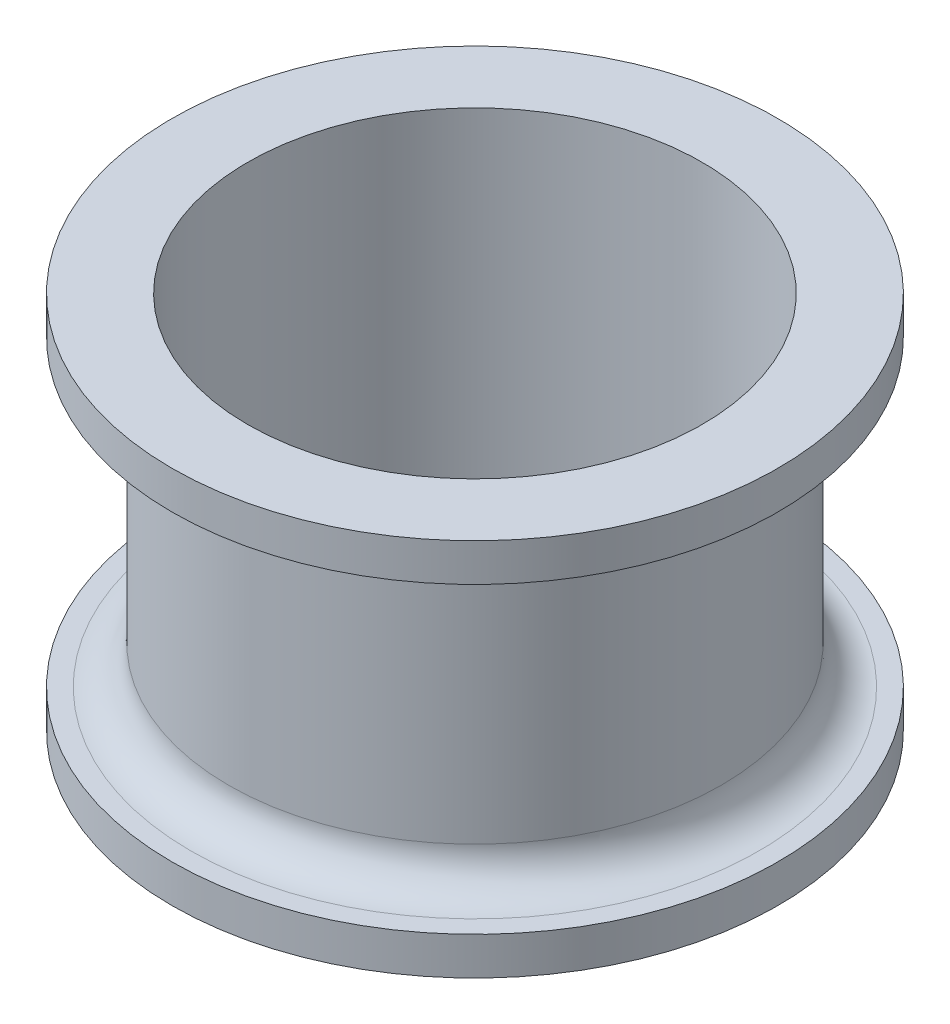
ISO-10303-21;
HEADER;
FILE_DESCRIPTION(('STEP AP214'),'2;1');
FILE_NAME('part.step','',(''),(''),'','','');
FILE_SCHEMA(('AUTOMOTIVE_DESIGN { 1 0 10303 214 1 1 1 1 }'));
ENDSEC;
DATA;
#1=APPLICATION_CONTEXT('core data for automotive mechanical design processes');
#2=APPLICATION_PROTOCOL_DEFINITION('international standard','automotive_design',2000,#1);
#3=PRODUCT_CONTEXT('',#1,'mechanical');
#4=PRODUCT('Part','Part','',(#3));
#5=PRODUCT_RELATED_PRODUCT_CATEGORY('part','',(#4));
#6=PRODUCT_DEFINITION_FORMATION('','',#4);
#7=PRODUCT_DEFINITION_CONTEXT('part definition',#1,'design');
#8=PRODUCT_DEFINITION('design','',#6,#7);
#9=PRODUCT_DEFINITION_SHAPE('','',#8);
#10=(LENGTH_UNIT() NAMED_UNIT(*) SI_UNIT(.MILLI.,.METRE.));
#11=(NAMED_UNIT(*) PLANE_ANGLE_UNIT() SI_UNIT($,.RADIAN.));
#12=(NAMED_UNIT(*) SI_UNIT($,.STERADIAN.) SOLID_ANGLE_UNIT());
#13=UNCERTAINTY_MEASURE_WITH_UNIT(LENGTH_MEASURE(1.E-05),#10,'distance_accuracy_value','');
#14=(GEOMETRIC_REPRESENTATION_CONTEXT(3) GLOBAL_UNCERTAINTY_ASSIGNED_CONTEXT((#13)) GLOBAL_UNIT_ASSIGNED_CONTEXT((#10,
#11,#12)) REPRESENTATION_CONTEXT('',''));
#15=CARTESIAN_POINT('',(0.,0.,0.));
#16=DIRECTION('',(0.,0.,1.));
#17=DIRECTION('',(1.,0.,0.));
#18=AXIS2_PLACEMENT_3D('',#15,#16,#17);
#19=CARTESIAN_POINT('',(0.,10.,0.));
#20=DIRECTION('',(0.,-1.,0.));
#21=DIRECTION('',(0.,0.,-1.));
#22=AXIS2_PLACEMENT_3D('',#19,#20,#21);
#23=CYLINDRICAL_SURFACE('',#22,6.5);
#24=CARTESIAN_POINT('',(0.,2.,0.));
#25=DIRECTION('',(0.,1.,0.));
#26=DIRECTION('',(0.,0.,1.));
#27=AXIS2_PLACEMENT_3D('',#24,#25,#26);
#28=CIRCLE('',#27,6.5);
#29=CARTESIAN_POINT('',(0.,2.,6.5));
#30=VERTEX_POINT('',#29);
#31=EDGE_CURVE('E50',#30,#30,#28,.T.);
#32=ORIENTED_EDGE('',*,*,#31,.T.);
#33=EDGE_LOOP('',(#32));
#34=FACE_BOUND('',#33,.T.);
#35=CARTESIAN_POINT('',(0.,8.,0.));
#36=DIRECTION('',(0.,1.,0.));
#37=DIRECTION('',(0.,0.,1.));
#38=AXIS2_PLACEMENT_3D('',#35,#36,#37);
#39=CIRCLE('',#38,6.5);
#40=CARTESIAN_POINT('',(0.,8.,6.5));
#41=VERTEX_POINT('',#40);
#42=EDGE_CURVE('E55',#41,#41,#39,.F.);
#43=ORIENTED_EDGE('',*,*,#42,.T.);
#44=EDGE_LOOP('',(#43));
#45=FACE_BOUND('',#44,.T.);
#46=ADVANCED_FACE('F37',(#34,#45),#23,.T.);
#47=CARTESIAN_POINT('',(0.,10.,0.));
#48=DIRECTION('',(0.,1.,0.));
#49=DIRECTION('',(0.,0.,1.));
#50=AXIS2_PLACEMENT_3D('',#47,#48,#49);
#51=PLANE('',#50);
#52=CARTESIAN_POINT('',(0.,10.,0.));
#53=DIRECTION('',(0.,1.,0.));
#54=DIRECTION('',(0.,0.,1.));
#55=AXIS2_PLACEMENT_3D('',#52,#53,#54);
#56=CIRCLE('',#55,6.);
#57=CARTESIAN_POINT('',(0.,10.,6.));
#58=VERTEX_POINT('',#57);
#59=EDGE_CURVE('E61',#58,#58,#56,.T.);
#60=ORIENTED_EDGE('',*,*,#59,.F.);
#61=EDGE_LOOP('',(#60));
#62=FACE_BOUND('',#61,.T.);
#63=CARTESIAN_POINT('',(0.,10.,0.));
#64=DIRECTION('',(0.,1.,0.));
#65=DIRECTION('',(0.,0.,1.));
#66=AXIS2_PLACEMENT_3D('',#63,#64,#65);
#67=CIRCLE('',#66,8.);
#68=CARTESIAN_POINT('',(0.,10.,8.));
#69=VERTEX_POINT('',#68);
#70=EDGE_CURVE('E70',#69,#69,#67,.T.);
#71=ORIENTED_EDGE('',*,*,#70,.T.);
#72=EDGE_LOOP('',(#71));
#73=FACE_BOUND('',#72,.T.);
#74=ADVANCED_FACE('F92',(#62,#73),#51,.T.);
#75=CARTESIAN_POINT('',(0.,0.,0.));
#76=DIRECTION('',(0.,1.,0.));
#77=DIRECTION('',(0.,0.,1.));
#78=AXIS2_PLACEMENT_3D('',#75,#76,#77);
#79=PLANE('',#78);
#80=CARTESIAN_POINT('',(0.,0.,0.));
#81=DIRECTION('',(0.,1.,0.));
#82=DIRECTION('',(0.,0.,1.));
#83=AXIS2_PLACEMENT_3D('',#80,#81,#82);
#84=CIRCLE('',#83,6.);
#85=CARTESIAN_POINT('',(0.,0.,6.));
#86=VERTEX_POINT('',#85);
#87=EDGE_CURVE('E62',#86,#86,#84,.T.);
#88=ORIENTED_EDGE('',*,*,#87,.T.);
#89=EDGE_LOOP('',(#88));
#90=FACE_BOUND('',#89,.T.);
#91=CARTESIAN_POINT('',(0.,0.,0.));
#92=DIRECTION('',(0.,1.,0.));
#93=DIRECTION('',(0.,0.,1.));
#94=AXIS2_PLACEMENT_3D('',#91,#92,#93);
#95=CIRCLE('',#94,8.);
#96=CARTESIAN_POINT('',(0.,0.,8.));
#97=VERTEX_POINT('',#96);
#98=EDGE_CURVE('E74',#97,#97,#95,.T.);
#99=ORIENTED_EDGE('',*,*,#98,.F.);
#100=EDGE_LOOP('',(#99));
#101=FACE_BOUND('',#100,.T.);
#102=ADVANCED_FACE('F89',(#90,#101),#79,.F.);
#103=CARTESIAN_POINT('',(0.,10.,0.));
#104=DIRECTION('',(0.,-1.,0.));
#105=DIRECTION('',(0.,0.,-1.));
#106=AXIS2_PLACEMENT_3D('',#103,#104,#105);
#107=CYLINDRICAL_SURFACE('',#106,6.);
#108=ORIENTED_EDGE('',*,*,#59,.T.);
#109=EDGE_LOOP('',(#108));
#110=FACE_BOUND('',#109,.T.);
#111=ORIENTED_EDGE('',*,*,#87,.F.);
#112=EDGE_LOOP('',(#111));
#113=FACE_BOUND('',#112,.T.);
#114=ADVANCED_FACE('F91',(#110,#113),#107,.F.);
#115=CARTESIAN_POINT('',(0.,9.,0.));
#116=DIRECTION('',(0.,1.,0.));
#117=DIRECTION('',(0.,0.,1.));
#118=AXIS2_PLACEMENT_3D('',#115,#116,#117);
#119=PLANE('',#118);
#120=CARTESIAN_POINT('',(0.,9.,0.));
#121=DIRECTION('',(0.,1.,0.));
#122=DIRECTION('',(0.,0.,1.));
#123=AXIS2_PLACEMENT_3D('',#120,#121,#122);
#124=CIRCLE('',#123,7.5);
#125=CARTESIAN_POINT('',(0.,9.,7.5));
#126=VERTEX_POINT('',#125);
#127=EDGE_CURVE('E10',#126,#126,#124,.T.);
#128=ORIENTED_EDGE('',*,*,#127,.T.);
#129=EDGE_LOOP('',(#128));
#130=FACE_BOUND('',#129,.T.);
#131=CARTESIAN_POINT('',(0.,9.,0.));
#132=DIRECTION('',(0.,1.,0.));
#133=DIRECTION('',(0.,0.,1.));
#134=AXIS2_PLACEMENT_3D('',#131,#132,#133);
#135=CIRCLE('',#134,8.);
#136=CARTESIAN_POINT('',(0.,9.,8.));
#137=VERTEX_POINT('',#136);
#138=EDGE_CURVE('E66',#137,#137,#135,.T.);
#139=ORIENTED_EDGE('',*,*,#138,.F.);
#140=EDGE_LOOP('',(#139));
#141=FACE_BOUND('',#140,.T.);
#142=ADVANCED_FACE('F99',(#130,#141),#119,.F.);
#143=CARTESIAN_POINT('',(0.,9.,0.));
#144=DIRECTION('',(0.,1.,0.));
#145=DIRECTION('',(0.,0.,1.));
#146=AXIS2_PLACEMENT_3D('',#143,#144,#145);
#147=CYLINDRICAL_SURFACE('',#146,8.);
#148=ORIENTED_EDGE('',*,*,#138,.T.);
#149=EDGE_LOOP('',(#148));
#150=FACE_BOUND('',#149,.T.);
#151=ORIENTED_EDGE('',*,*,#70,.F.);
#152=EDGE_LOOP('',(#151));
#153=FACE_BOUND('',#152,.T.);
#154=ADVANCED_FACE('F125',(#150,#153),#147,.T.);
#155=CARTESIAN_POINT('',(0.,1.,0.));
#156=DIRECTION('',(0.,1.,0.));
#157=DIRECTION('',(0.,0.,1.));
#158=AXIS2_PLACEMENT_3D('',#155,#156,#157);
#159=PLANE('',#158);
#160=CARTESIAN_POINT('',(0.,1.,0.));
#161=DIRECTION('',(0.,1.,0.));
#162=DIRECTION('',(0.,0.,1.));
#163=AXIS2_PLACEMENT_3D('',#160,#161,#162);
#164=CIRCLE('',#163,7.5);
#165=CARTESIAN_POINT('',(0.,1.,7.5));
#166=VERTEX_POINT('',#165);
#167=EDGE_CURVE('E45',#166,#166,#164,.F.);
#168=ORIENTED_EDGE('',*,*,#167,.T.);
#169=EDGE_LOOP('',(#168));
#170=FACE_BOUND('',#169,.T.);
#171=CARTESIAN_POINT('',(0.,1.,0.));
#172=DIRECTION('',(0.,1.,0.));
#173=DIRECTION('',(0.,0.,1.));
#174=AXIS2_PLACEMENT_3D('',#171,#172,#173);
#175=CIRCLE('',#174,8.);
#176=CARTESIAN_POINT('',(0.,1.,8.));
#177=VERTEX_POINT('',#176);
#178=EDGE_CURVE('E78',#177,#177,#175,.T.);
#179=ORIENTED_EDGE('',*,*,#178,.T.);
#180=EDGE_LOOP('',(#179));
#181=FACE_BOUND('',#180,.T.);
#182=ADVANCED_FACE('F118',(#170,#181),#159,.T.);
#183=CARTESIAN_POINT('',(0.,0.,0.));
#184=DIRECTION('',(0.,1.,0.));
#185=DIRECTION('',(0.,0.,1.));
#186=AXIS2_PLACEMENT_3D('',#183,#184,#185);
#187=CYLINDRICAL_SURFACE('',#186,8.);
#188=ORIENTED_EDGE('',*,*,#98,.T.);
#189=EDGE_LOOP('',(#188));
#190=FACE_BOUND('',#189,.T.);
#191=ORIENTED_EDGE('',*,*,#178,.F.);
#192=EDGE_LOOP('',(#191));
#193=FACE_BOUND('',#192,.T.);
#194=ADVANCED_FACE('F86',(#190,#193),#187,.T.);
#195=CARTESIAN_POINT('',(0.,2.,0.));
#196=DIRECTION('',(0.,1.,0.));
#197=DIRECTION('',(0.,0.,1.));
#198=AXIS2_PLACEMENT_3D('',#195,#196,#197);
#199=TOROIDAL_SURFACE('',#198,7.5,1.);
#200=ORIENTED_EDGE('',*,*,#167,.F.);
#201=EDGE_LOOP('',(#200));
#202=FACE_BOUND('',#201,.T.);
#203=ORIENTED_EDGE('',*,*,#31,.F.);
#204=EDGE_LOOP('',(#203));
#205=FACE_BOUND('',#204,.T.);
#206=ADVANCED_FACE('F110',(#202,#205),#199,.F.);
#207=CARTESIAN_POINT('',(0.,8.,0.));
#208=DIRECTION('',(0.,1.,0.));
#209=DIRECTION('',(0.,0.,1.));
#210=AXIS2_PLACEMENT_3D('',#207,#208,#209);
#211=TOROIDAL_SURFACE('',#210,7.5,1.);
#212=ORIENTED_EDGE('',*,*,#42,.F.);
#213=EDGE_LOOP('',(#212));
#214=FACE_BOUND('',#213,.T.);
#215=ORIENTED_EDGE('',*,*,#127,.F.);
#216=EDGE_LOOP('',(#215));
#217=FACE_BOUND('',#216,.T.);
#218=ADVANCED_FACE('F39',(#214,#217),#211,.F.);
#219=CLOSED_SHELL('',(#46,#74,#102,#114,#142,#154,#182,#194,#206,#218));
#220=MANIFOLD_SOLID_BREP('B2',#219);
#221=ADVANCED_BREP_SHAPE_REPRESENTATION('',(#18,#220),#14);
#222=SHAPE_DEFINITION_REPRESENTATION(#9,#221);
ENDSEC;
END-ISO-10303-21;
